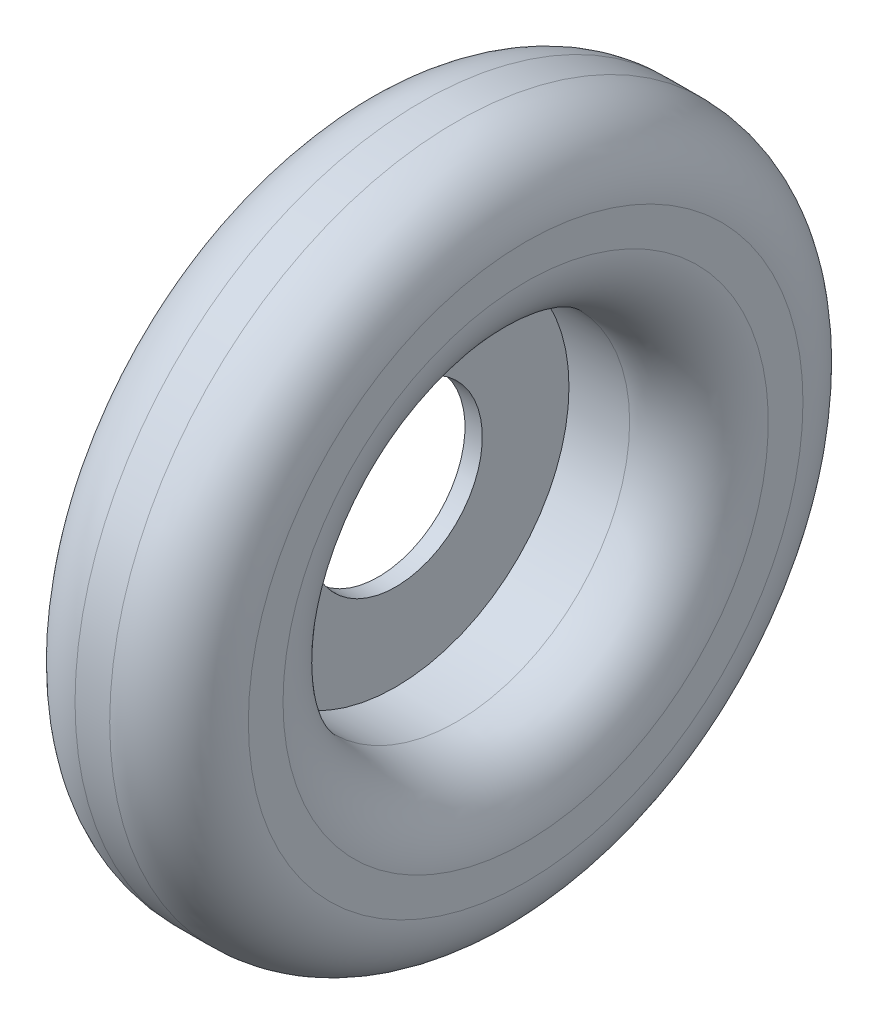
ISO-10303-21;
HEADER;
FILE_DESCRIPTION(('STEP AP214'),'2;1');
FILE_NAME('part.step','',(''),(''),'','','');
FILE_SCHEMA(('AUTOMOTIVE_DESIGN { 1 0 10303 214 1 1 1 1 }'));
ENDSEC;
DATA;
#1=APPLICATION_CONTEXT('core data for automotive mechanical design processes');
#2=APPLICATION_PROTOCOL_DEFINITION('international standard','automotive_design',2000,#1);
#3=PRODUCT_CONTEXT('',#1,'mechanical');
#4=PRODUCT('Part','Part','',(#3));
#5=PRODUCT_RELATED_PRODUCT_CATEGORY('part','',(#4));
#6=PRODUCT_DEFINITION_FORMATION('','',#4);
#7=PRODUCT_DEFINITION_CONTEXT('part definition',#1,'design');
#8=PRODUCT_DEFINITION('design','',#6,#7);
#9=PRODUCT_DEFINITION_SHAPE('','',#8);
#10=(LENGTH_UNIT() NAMED_UNIT(*) SI_UNIT(.MILLI.,.METRE.));
#11=(NAMED_UNIT(*) PLANE_ANGLE_UNIT() SI_UNIT($,.RADIAN.));
#12=(NAMED_UNIT(*) SI_UNIT($,.STERADIAN.) SOLID_ANGLE_UNIT());
#13=UNCERTAINTY_MEASURE_WITH_UNIT(LENGTH_MEASURE(1.E-05),#10,'distance_accuracy_value','');
#14=(GEOMETRIC_REPRESENTATION_CONTEXT(3) GLOBAL_UNCERTAINTY_ASSIGNED_CONTEXT((#13)) GLOBAL_UNIT_ASSIGNED_CONTEXT((#10,
#11,#12)) REPRESENTATION_CONTEXT('',''));
#15=CARTESIAN_POINT('',(0.,0.,0.));
#16=DIRECTION('',(0.,0.,1.));
#17=DIRECTION('',(1.,0.,0.));
#18=AXIS2_PLACEMENT_3D('',#15,#16,#17);
#19=CARTESIAN_POINT('',(0.,0.,0.));
#20=DIRECTION('',(-1.,0.,0.));
#21=DIRECTION('',(0.,0.,1.));
#22=AXIS2_PLACEMENT_3D('',#19,#20,#21);
#23=TOROIDAL_SURFACE('',#22,115.,15.);
#24=CARTESIAN_POINT('',(0.,0.,0.));
#25=DIRECTION('',(-1.,0.,0.));
#26=DIRECTION('',(0.,0.,1.));
#27=AXIS2_PLACEMENT_3D('',#24,#25,#26);
#28=CIRCLE('',#27,100.);
#29=CARTESIAN_POINT('',(0.,0.,100.));
#30=VERTEX_POINT('',#29);
#31=EDGE_CURVE('E99',#30,#30,#28,.T.);
#32=ORIENTED_EDGE('',*,*,#31,.F.);
#33=EDGE_LOOP('',(#32));
#34=FACE_BOUND('',#33,.T.);
#35=CARTESIAN_POINT('',(-15.,0.,0.));
#36=DIRECTION('',(-1.,0.,0.));
#37=DIRECTION('',(0.,0.,1.));
#38=AXIS2_PLACEMENT_3D('',#35,#36,#37);
#39=CIRCLE('',#38,115.);
#40=CARTESIAN_POINT('',(-15.,0.,115.));
#41=VERTEX_POINT('',#40);
#42=EDGE_CURVE('E69',#41,#41,#39,.T.);
#43=ORIENTED_EDGE('',*,*,#42,.T.);
#44=EDGE_LOOP('',(#43));
#45=FACE_BOUND('',#44,.T.);
#46=ADVANCED_FACE('F36',(#34,#45),#23,.T.);
#47=CARTESIAN_POINT('',(-15.,160.,0.));
#48=DIRECTION('',(1.,0.,0.));
#49=DIRECTION('',(0.,0.,-1.));
#50=AXIS2_PLACEMENT_3D('',#47,#48,#49);
#51=PLANE('',#50);
#52=ORIENTED_EDGE('',*,*,#42,.F.);
#53=EDGE_LOOP('',(#52));
#54=FACE_BOUND('',#53,.T.);
#55=CARTESIAN_POINT('',(-15.,0.,0.));
#56=DIRECTION('',(-1.,0.,0.));
#57=DIRECTION('',(0.,0.,1.));
#58=AXIS2_PLACEMENT_3D('',#55,#56,#57);
#59=CIRCLE('',#58,160.);
#60=CARTESIAN_POINT('',(-15.,0.,160.));
#61=VERTEX_POINT('',#60);
#62=EDGE_CURVE('E72',#61,#61,#59,.T.);
#63=ORIENTED_EDGE('',*,*,#62,.T.);
#64=EDGE_LOOP('',(#63));
#65=FACE_BOUND('',#64,.T.);
#66=ADVANCED_FACE('F107',(#54,#65),#51,.F.);
#67=CARTESIAN_POINT('',(25.,0.,0.));
#68=DIRECTION('',(-1.,0.,0.));
#69=DIRECTION('',(0.,0.,1.));
#70=AXIS2_PLACEMENT_3D('',#67,#68,#69);
#71=TOROIDAL_SURFACE('',#70,160.,40.);
#72=ORIENTED_EDGE('',*,*,#62,.F.);
#73=EDGE_LOOP('',(#72));
#74=FACE_BOUND('',#73,.T.);
#75=CARTESIAN_POINT('',(25.,0.,0.));
#76=DIRECTION('',(-1.,0.,0.));
#77=DIRECTION('',(0.,0.,1.));
#78=AXIS2_PLACEMENT_3D('',#75,#76,#77);
#79=CIRCLE('',#78,200.);
#80=CARTESIAN_POINT('',(25.,0.,200.));
#81=VERTEX_POINT('',#80);
#82=EDGE_CURVE('E75',#81,#81,#79,.T.);
#83=ORIENTED_EDGE('',*,*,#82,.T.);
#84=EDGE_LOOP('',(#83));
#85=FACE_BOUND('',#84,.T.);
#86=ADVANCED_FACE('F113',(#74,#85),#71,.T.);
#87=CARTESIAN_POINT('',(0.,0.,0.));
#88=DIRECTION('',(-1.,0.,0.));
#89=DIRECTION('',(0.,0.,1.));
#90=AXIS2_PLACEMENT_3D('',#87,#88,#89);
#91=CYLINDRICAL_SURFACE('',#90,200.);
#92=ORIENTED_EDGE('',*,*,#82,.F.);
#93=EDGE_LOOP('',(#92));
#94=FACE_BOUND('',#93,.T.);
#95=CARTESIAN_POINT('',(45.,0.,0.));
#96=DIRECTION('',(-1.,0.,0.));
#97=DIRECTION('',(0.,0.,1.));
#98=AXIS2_PLACEMENT_3D('',#95,#96,#97);
#99=CIRCLE('',#98,200.);
#100=CARTESIAN_POINT('',(45.,0.,200.));
#101=VERTEX_POINT('',#100);
#102=EDGE_CURVE('E78',#101,#101,#99,.T.);
#103=ORIENTED_EDGE('',*,*,#102,.T.);
#104=EDGE_LOOP('',(#103));
#105=FACE_BOUND('',#104,.T.);
#106=ADVANCED_FACE('F119',(#94,#105),#91,.T.);
#107=CARTESIAN_POINT('',(45.,0.,0.));
#108=DIRECTION('',(-1.,0.,0.));
#109=DIRECTION('',(0.,0.,1.));
#110=AXIS2_PLACEMENT_3D('',#107,#108,#109);
#111=TOROIDAL_SURFACE('',#110,160.,40.);
#112=ORIENTED_EDGE('',*,*,#102,.F.);
#113=EDGE_LOOP('',(#112));
#114=FACE_BOUND('',#113,.T.);
#115=CARTESIAN_POINT('',(85.,0.,0.));
#116=DIRECTION('',(-1.,0.,0.));
#117=DIRECTION('',(0.,0.,1.));
#118=AXIS2_PLACEMENT_3D('',#115,#116,#117);
#119=CIRCLE('',#118,160.);
#120=CARTESIAN_POINT('',(85.,0.,160.));
#121=VERTEX_POINT('',#120);
#122=EDGE_CURVE('E81',#121,#121,#119,.T.);
#123=ORIENTED_EDGE('',*,*,#122,.T.);
#124=EDGE_LOOP('',(#123));
#125=FACE_BOUND('',#124,.T.);
#126=ADVANCED_FACE('F125',(#114,#125),#111,.T.);
#127=CARTESIAN_POINT('',(85.,160.,0.));
#128=DIRECTION('',(-1.,0.,0.));
#129=DIRECTION('',(0.,0.,1.));
#130=AXIS2_PLACEMENT_3D('',#127,#128,#129);
#131=PLANE('',#130);
#132=ORIENTED_EDGE('',*,*,#122,.F.);
#133=EDGE_LOOP('',(#132));
#134=FACE_BOUND('',#133,.T.);
#135=CARTESIAN_POINT('',(85.,0.,0.));
#136=DIRECTION('',(-1.,0.,0.));
#137=DIRECTION('',(0.,0.,1.));
#138=AXIS2_PLACEMENT_3D('',#135,#136,#137);
#139=CIRCLE('',#138,140.);
#140=CARTESIAN_POINT('',(85.,0.,140.));
#141=VERTEX_POINT('',#140);
#142=EDGE_CURVE('E84',#141,#141,#139,.T.);
#143=ORIENTED_EDGE('',*,*,#142,.T.);
#144=EDGE_LOOP('',(#143));
#145=FACE_BOUND('',#144,.T.);
#146=ADVANCED_FACE('F131',(#134,#145),#131,.F.);
#147=CARTESIAN_POINT('',(45.,0.,0.));
#148=DIRECTION('',(-1.,0.,0.));
#149=DIRECTION('',(0.,0.,1.));
#150=AXIS2_PLACEMENT_3D('',#147,#148,#149);
#151=TOROIDAL_SURFACE('',#150,140.,40.);
#152=ORIENTED_EDGE('',*,*,#142,.F.);
#153=EDGE_LOOP('',(#152));
#154=FACE_BOUND('',#153,.T.);
#155=CARTESIAN_POINT('',(45.,0.,0.));
#156=DIRECTION('',(-1.,0.,0.));
#157=DIRECTION('',(0.,0.,1.));
#158=AXIS2_PLACEMENT_3D('',#155,#156,#157);
#159=CIRCLE('',#158,100.);
#160=CARTESIAN_POINT('',(45.,0.,100.));
#161=VERTEX_POINT('',#160);
#162=EDGE_CURVE('E87',#161,#161,#159,.T.);
#163=ORIENTED_EDGE('',*,*,#162,.T.);
#164=EDGE_LOOP('',(#163));
#165=FACE_BOUND('',#164,.T.);
#166=ADVANCED_FACE('F137',(#154,#165),#151,.T.);
#167=CARTESIAN_POINT('',(0.,0.,0.));
#168=DIRECTION('',(-1.,0.,0.));
#169=DIRECTION('',(0.,0.,1.));
#170=AXIS2_PLACEMENT_3D('',#167,#168,#169);
#171=CYLINDRICAL_SURFACE('',#170,100.);
#172=ORIENTED_EDGE('',*,*,#162,.F.);
#173=EDGE_LOOP('',(#172));
#174=FACE_BOUND('',#173,.T.);
#175=CARTESIAN_POINT('',(9.99999999999999,0.,0.));
#176=DIRECTION('',(-1.,0.,0.));
#177=DIRECTION('',(0.,0.,1.));
#178=AXIS2_PLACEMENT_3D('',#175,#176,#177);
#179=CIRCLE('',#178,100.);
#180=CARTESIAN_POINT('',(9.99999999999999,0.,100.));
#181=VERTEX_POINT('',#180);
#182=EDGE_CURVE('E90',#181,#181,#179,.T.);
#183=ORIENTED_EDGE('',*,*,#182,.T.);
#184=EDGE_LOOP('',(#183));
#185=FACE_BOUND('',#184,.T.);
#186=ADVANCED_FACE('F143',(#174,#185),#171,.F.);
#187=CARTESIAN_POINT('',(10.,100.,0.));
#188=DIRECTION('',(-1.,0.,0.));
#189=DIRECTION('',(0.,0.,1.));
#190=AXIS2_PLACEMENT_3D('',#187,#188,#189);
#191=PLANE('',#190);
#192=ORIENTED_EDGE('',*,*,#182,.F.);
#193=EDGE_LOOP('',(#192));
#194=FACE_BOUND('',#193,.T.);
#195=CARTESIAN_POINT('',(10.,0.,0.));
#196=DIRECTION('',(-1.,0.,0.));
#197=DIRECTION('',(0.,0.,1.));
#198=AXIS2_PLACEMENT_3D('',#195,#196,#197);
#199=CIRCLE('',#198,50.);
#200=CARTESIAN_POINT('',(10.,0.,50.));
#201=VERTEX_POINT('',#200);
#202=EDGE_CURVE('E93',#201,#201,#199,.T.);
#203=ORIENTED_EDGE('',*,*,#202,.T.);
#204=EDGE_LOOP('',(#203));
#205=FACE_BOUND('',#204,.T.);
#206=ADVANCED_FACE('F149',(#194,#205),#191,.F.);
#207=CARTESIAN_POINT('',(0.,0.,0.));
#208=DIRECTION('',(-1.,0.,0.));
#209=DIRECTION('',(0.,0.,1.));
#210=AXIS2_PLACEMENT_3D('',#207,#208,#209);
#211=CYLINDRICAL_SURFACE('',#210,50.);
#212=ORIENTED_EDGE('',*,*,#202,.F.);
#213=EDGE_LOOP('',(#212));
#214=FACE_BOUND('',#213,.T.);
#215=CARTESIAN_POINT('',(0.,0.,0.));
#216=DIRECTION('',(-1.,0.,0.));
#217=DIRECTION('',(0.,0.,1.));
#218=AXIS2_PLACEMENT_3D('',#215,#216,#217);
#219=CIRCLE('',#218,50.);
#220=CARTESIAN_POINT('',(0.,0.,50.));
#221=VERTEX_POINT('',#220);
#222=EDGE_CURVE('E96',#221,#221,#219,.T.);
#223=ORIENTED_EDGE('',*,*,#222,.T.);
#224=EDGE_LOOP('',(#223));
#225=FACE_BOUND('',#224,.T.);
#226=ADVANCED_FACE('F155',(#214,#225),#211,.F.);
#227=CARTESIAN_POINT('',(0.,50.,0.));
#228=DIRECTION('',(1.,0.,0.));
#229=DIRECTION('',(0.,0.,-1.));
#230=AXIS2_PLACEMENT_3D('',#227,#228,#229);
#231=PLANE('',#230);
#232=ORIENTED_EDGE('',*,*,#222,.F.);
#233=EDGE_LOOP('',(#232));
#234=FACE_BOUND('',#233,.T.);
#235=ORIENTED_EDGE('',*,*,#31,.T.);
#236=EDGE_LOOP('',(#235));
#237=FACE_BOUND('',#236,.T.);
#238=ADVANCED_FACE('F103',(#234,#237),#231,.F.);
#239=CLOSED_SHELL('',(#46,#66,#86,#106,#126,#146,#166,#186,#206,#226,#238));
#240=CARTESIAN_POINT('',(25.,0.,0.));
#241=DIRECTION('',(-1.,0.,0.));
#242=DIRECTION('',(0.,0.,1.));
#243=AXIS2_PLACEMENT_3D('',#240,#241,#242);
#244=TOROIDAL_SURFACE('',#243,160.,35.);
#245=CARTESIAN_POINT('',(-10.,0.,0.));
#246=DIRECTION('',(-1.,0.,0.));
#247=DIRECTION('',(0.,0.,1.));
#248=AXIS2_PLACEMENT_3D('',#245,#246,#247);
#249=CIRCLE('',#248,160.);
#250=CARTESIAN_POINT('',(-10.,0.,160.));
#251=VERTEX_POINT('',#250);
#252=EDGE_CURVE('E10',#251,#251,#249,.T.);
#253=ORIENTED_EDGE('',*,*,#252,.T.);
#254=EDGE_LOOP('',(#253));
#255=FACE_BOUND('',#254,.T.);
#256=CARTESIAN_POINT('',(25.,0.,0.));
#257=DIRECTION('',(-1.,0.,0.));
#258=DIRECTION('',(0.,0.,1.));
#259=AXIS2_PLACEMENT_3D('',#256,#257,#258);
#260=CIRCLE('',#259,195.);
#261=CARTESIAN_POINT('',(25.,0.,195.));
#262=VERTEX_POINT('',#261);
#263=EDGE_CURVE('E66',#262,#262,#260,.T.);
#264=ORIENTED_EDGE('',*,*,#263,.F.);
#265=EDGE_LOOP('',(#264));
#266=FACE_BOUND('',#265,.T.);
#267=ADVANCED_FACE('F38',(#255,#266),#244,.F.);
#268=CARTESIAN_POINT('',(-10.,160.,0.));
#269=DIRECTION('',(1.,0.,0.));
#270=DIRECTION('',(0.,0.,-1.));
#271=AXIS2_PLACEMENT_3D('',#268,#269,#270);
#272=PLANE('',#271);
#273=CARTESIAN_POINT('',(-10.,0.,0.));
#274=DIRECTION('',(-1.,0.,0.));
#275=DIRECTION('',(0.,0.,1.));
#276=AXIS2_PLACEMENT_3D('',#273,#274,#275);
#277=CIRCLE('',#276,115.);
#278=CARTESIAN_POINT('',(-10.,0.,115.));
#279=VERTEX_POINT('',#278);
#280=EDGE_CURVE('E44',#279,#279,#277,.T.);
#281=ORIENTED_EDGE('',*,*,#280,.T.);
#282=EDGE_LOOP('',(#281));
#283=FACE_BOUND('',#282,.T.);
#284=ORIENTED_EDGE('',*,*,#252,.F.);
#285=EDGE_LOOP('',(#284));
#286=FACE_BOUND('',#285,.T.);
#287=ADVANCED_FACE('F193',(#283,#286),#272,.T.);
#288=CARTESIAN_POINT('',(0.,0.,0.));
#289=DIRECTION('',(-1.,0.,0.));
#290=DIRECTION('',(0.,0.,1.));
#291=AXIS2_PLACEMENT_3D('',#288,#289,#290);
#292=TOROIDAL_SURFACE('',#291,115.,10.);
#293=CARTESIAN_POINT('',(0.,0.,0.));
#294=DIRECTION('',(-1.,0.,0.));
#295=DIRECTION('',(0.,0.,1.));
#296=AXIS2_PLACEMENT_3D('',#293,#294,#295);
#297=CIRCLE('',#296,105.);
#298=CARTESIAN_POINT('',(0.,0.,105.));
#299=VERTEX_POINT('',#298);
#300=EDGE_CURVE('E48',#299,#299,#297,.T.);
#301=ORIENTED_EDGE('',*,*,#300,.T.);
#302=EDGE_LOOP('',(#301));
#303=FACE_BOUND('',#302,.T.);
#304=ORIENTED_EDGE('',*,*,#280,.F.);
#305=EDGE_LOOP('',(#304));
#306=FACE_BOUND('',#305,.T.);
#307=ADVANCED_FACE('F190',(#303,#306),#292,.F.);
#308=CARTESIAN_POINT('',(0.,0.,0.));
#309=DIRECTION('',(-1.,0.,0.));
#310=DIRECTION('',(0.,0.,1.));
#311=AXIS2_PLACEMENT_3D('',#308,#309,#310);
#312=CYLINDRICAL_SURFACE('',#311,105.);
#313=CARTESIAN_POINT('',(45.,0.,0.));
#314=DIRECTION('',(-1.,0.,0.));
#315=DIRECTION('',(0.,0.,1.));
#316=AXIS2_PLACEMENT_3D('',#313,#314,#315);
#317=CIRCLE('',#316,105.);
#318=CARTESIAN_POINT('',(45.,0.,105.));
#319=VERTEX_POINT('',#318);
#320=EDGE_CURVE('E52',#319,#319,#317,.T.);
#321=ORIENTED_EDGE('',*,*,#320,.T.);
#322=EDGE_LOOP('',(#321));
#323=FACE_BOUND('',#322,.T.);
#324=ORIENTED_EDGE('',*,*,#300,.F.);
#325=EDGE_LOOP('',(#324));
#326=FACE_BOUND('',#325,.T.);
#327=ADVANCED_FACE('F186',(#323,#326),#312,.T.);
#328=CARTESIAN_POINT('',(45.,0.,0.));
#329=DIRECTION('',(-1.,0.,0.));
#330=DIRECTION('',(0.,0.,1.));
#331=AXIS2_PLACEMENT_3D('',#328,#329,#330);
#332=TOROIDAL_SURFACE('',#331,140.,35.);
#333=CARTESIAN_POINT('',(80.,0.,0.));
#334=DIRECTION('',(-1.,0.,0.));
#335=DIRECTION('',(0.,0.,1.));
#336=AXIS2_PLACEMENT_3D('',#333,#334,#335);
#337=CIRCLE('',#336,140.);
#338=CARTESIAN_POINT('',(80.,0.,140.));
#339=VERTEX_POINT('',#338);
#340=EDGE_CURVE('E57',#339,#339,#337,.T.);
#341=ORIENTED_EDGE('',*,*,#340,.T.);
#342=EDGE_LOOP('',(#341));
#343=FACE_BOUND('',#342,.T.);
#344=ORIENTED_EDGE('',*,*,#320,.F.);
#345=EDGE_LOOP('',(#344));
#346=FACE_BOUND('',#345,.T.);
#347=ADVANCED_FACE('F182',(#343,#346),#332,.F.);
#348=CARTESIAN_POINT('',(80.,160.,0.));
#349=DIRECTION('',(-1.,0.,0.));
#350=DIRECTION('',(0.,0.,1.));
#351=AXIS2_PLACEMENT_3D('',#348,#349,#350);
#352=PLANE('',#351);
#353=CARTESIAN_POINT('',(80.,0.,0.));
#354=DIRECTION('',(-1.,0.,0.));
#355=DIRECTION('',(0.,0.,1.));
#356=AXIS2_PLACEMENT_3D('',#353,#354,#355);
#357=CIRCLE('',#356,160.);
#358=CARTESIAN_POINT('',(80.,0.,160.));
#359=VERTEX_POINT('',#358);
#360=EDGE_CURVE('E60',#359,#359,#357,.T.);
#361=ORIENTED_EDGE('',*,*,#360,.T.);
#362=EDGE_LOOP('',(#361));
#363=FACE_BOUND('',#362,.T.);
#364=ORIENTED_EDGE('',*,*,#340,.F.);
#365=EDGE_LOOP('',(#364));
#366=FACE_BOUND('',#365,.T.);
#367=ADVANCED_FACE('F178',(#363,#366),#352,.T.);
#368=CARTESIAN_POINT('',(45.,0.,0.));
#369=DIRECTION('',(-1.,0.,0.));
#370=DIRECTION('',(0.,0.,1.));
#371=AXIS2_PLACEMENT_3D('',#368,#369,#370);
#372=TOROIDAL_SURFACE('',#371,160.,35.);
#373=CARTESIAN_POINT('',(45.,0.,0.));
#374=DIRECTION('',(-1.,0.,0.));
#375=DIRECTION('',(0.,0.,1.));
#376=AXIS2_PLACEMENT_3D('',#373,#374,#375);
#377=CIRCLE('',#376,195.);
#378=CARTESIAN_POINT('',(45.,0.,195.));
#379=VERTEX_POINT('',#378);
#380=EDGE_CURVE('E63',#379,#379,#377,.T.);
#381=ORIENTED_EDGE('',*,*,#380,.T.);
#382=EDGE_LOOP('',(#381));
#383=FACE_BOUND('',#382,.T.);
#384=ORIENTED_EDGE('',*,*,#360,.F.);
#385=EDGE_LOOP('',(#384));
#386=FACE_BOUND('',#385,.T.);
#387=ADVANCED_FACE('F173',(#383,#386),#372,.F.);
#388=CARTESIAN_POINT('',(0.,0.,0.));
#389=DIRECTION('',(-1.,0.,0.));
#390=DIRECTION('',(0.,0.,1.));
#391=AXIS2_PLACEMENT_3D('',#388,#389,#390);
#392=CYLINDRICAL_SURFACE('',#391,195.);
#393=ORIENTED_EDGE('',*,*,#263,.T.);
#394=EDGE_LOOP('',(#393));
#395=FACE_BOUND('',#394,.T.);
#396=ORIENTED_EDGE('',*,*,#380,.F.);
#397=EDGE_LOOP('',(#396));
#398=FACE_BOUND('',#397,.T.);
#399=ADVANCED_FACE('F170',(#395,#398),#392,.F.);
#400=CLOSED_SHELL('',(#267,#287,#307,#327,#347,#367,#387,#399));
#401=ORIENTED_CLOSED_SHELL('',*,#400,.T.);
#402=BREP_WITH_VOIDS('B2',#239,(#401));
#403=ADVANCED_BREP_SHAPE_REPRESENTATION('',(#18,#402),#14);
#404=SHAPE_DEFINITION_REPRESENTATION(#9,#403);
ENDSEC;
END-ISO-10303-21;
